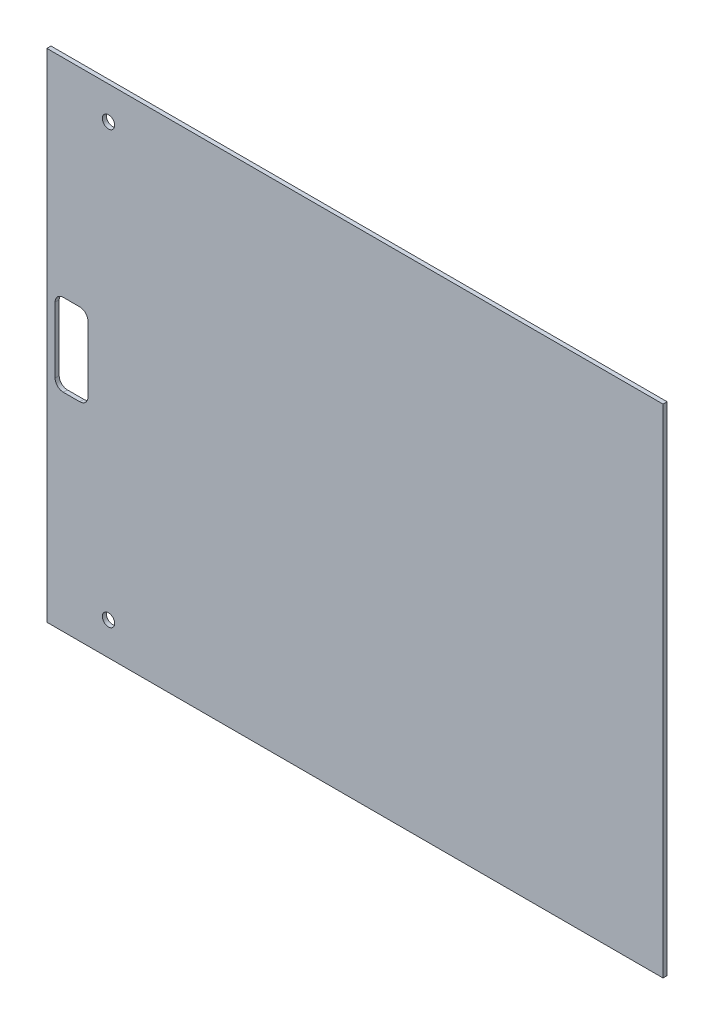
ISO-10303-21;
HEADER;
FILE_DESCRIPTION(('STEP AP214'),'2;1');
FILE_NAME('part.step','',(''),(''),'','','');
FILE_SCHEMA(('AUTOMOTIVE_DESIGN { 1 0 10303 214 1 1 1 1 }'));
ENDSEC;
DATA;
#1=APPLICATION_CONTEXT('core data for automotive mechanical design processes');
#2=APPLICATION_PROTOCOL_DEFINITION('international standard','automotive_design',2000,#1);
#3=PRODUCT_CONTEXT('',#1,'mechanical');
#4=PRODUCT('Part','Part','',(#3));
#5=PRODUCT_RELATED_PRODUCT_CATEGORY('part','',(#4));
#6=PRODUCT_DEFINITION_FORMATION('','',#4);
#7=PRODUCT_DEFINITION_CONTEXT('part definition',#1,'design');
#8=PRODUCT_DEFINITION('design','',#6,#7);
#9=PRODUCT_DEFINITION_SHAPE('','',#8);
#10=(LENGTH_UNIT() NAMED_UNIT(*) SI_UNIT(.MILLI.,.METRE.));
#11=(NAMED_UNIT(*) PLANE_ANGLE_UNIT() SI_UNIT($,.RADIAN.));
#12=(NAMED_UNIT(*) SI_UNIT($,.STERADIAN.) SOLID_ANGLE_UNIT());
#13=UNCERTAINTY_MEASURE_WITH_UNIT(LENGTH_MEASURE(1.E-05),#10,'distance_accuracy_value','');
#14=(GEOMETRIC_REPRESENTATION_CONTEXT(3) GLOBAL_UNCERTAINTY_ASSIGNED_CONTEXT((#13)) GLOBAL_UNIT_ASSIGNED_CONTEXT((#10,
#11,#12)) REPRESENTATION_CONTEXT('',''));
#15=CARTESIAN_POINT('',(0.,0.,0.));
#16=DIRECTION('',(0.,0.,1.));
#17=DIRECTION('',(1.,0.,0.));
#18=AXIS2_PLACEMENT_3D('',#15,#16,#17);
#19=CARTESIAN_POINT('',(0.,0.,1.));
#20=DIRECTION('',(0.,0.,1.));
#21=DIRECTION('',(1.,0.,0.));
#22=AXIS2_PLACEMENT_3D('',#19,#20,#21);
#23=PLANE('',#22);
#24=CARTESIAN_POINT('',(-60.,52.5,1.));
#25=DIRECTION('',(0.,0.,1.));
#26=DIRECTION('',(1.,0.,0.));
#27=AXIS2_PLACEMENT_3D('',#24,#25,#26);
#28=CIRCLE('',#27,1.5);
#29=CARTESIAN_POINT('',(-58.5,52.5,1.));
#30=VERTEX_POINT('',#29);
#31=EDGE_CURVE('E193',#30,#30,#28,.T.);
#32=ORIENTED_EDGE('',*,*,#31,.F.);
#33=EDGE_LOOP('',(#32));
#34=FACE_BOUND('',#33,.T.);
#35=DIRECTION('',(0.,1.,0.));
#36=VECTOR('',#35,1.);
#37=CARTESIAN_POINT('',(75.,60.5,1.));
#38=LINE('',#37,#36);
#39=CARTESIAN_POINT('',(75.,-60.5,1.));
#40=VERTEX_POINT('',#39);
#41=CARTESIAN_POINT('',(75.,60.5,1.));
#42=VERTEX_POINT('',#41);
#43=EDGE_CURVE('E199',#40,#42,#38,.T.);
#44=ORIENTED_EDGE('',*,*,#43,.T.);
#45=DIRECTION('',(-1.,0.,0.));
#46=VECTOR('',#45,1.);
#47=CARTESIAN_POINT('',(-75.,60.5,1.));
#48=LINE('',#47,#46);
#49=CARTESIAN_POINT('',(-75.,60.5,1.));
#50=VERTEX_POINT('',#49);
#51=EDGE_CURVE('E202',#42,#50,#48,.T.);
#52=ORIENTED_EDGE('',*,*,#51,.T.);
#53=DIRECTION('',(0.,-1.,0.));
#54=VECTOR('',#53,1.);
#55=CARTESIAN_POINT('',(-75.,60.5,1.));
#56=LINE('',#55,#54);
#57=CARTESIAN_POINT('',(-75.,-60.5,1.));
#58=VERTEX_POINT('',#57);
#59=EDGE_CURVE('E205',#50,#58,#56,.T.);
#60=ORIENTED_EDGE('',*,*,#59,.T.);
#61=DIRECTION('',(1.,0.,0.));
#62=VECTOR('',#61,1.);
#63=CARTESIAN_POINT('',(-75.,-60.5,1.));
#64=LINE('',#63,#62);
#65=EDGE_CURVE('E207',#58,#40,#64,.T.);
#66=ORIENTED_EDGE('',*,*,#65,.T.);
#67=EDGE_LOOP('',(#44,#52,#60,#66));
#68=FACE_BOUND('',#67,.T.);
#69=CARTESIAN_POINT('',(-60.,-52.5,1.));
#70=DIRECTION('',(0.,0.,1.));
#71=DIRECTION('',(1.,0.,0.));
#72=AXIS2_PLACEMENT_3D('',#69,#70,#71);
#73=CIRCLE('',#72,1.5);
#74=CARTESIAN_POINT('',(-58.5,-52.5,1.));
#75=VERTEX_POINT('',#74);
#76=EDGE_CURVE('E187',#75,#75,#73,.T.);
#77=ORIENTED_EDGE('',*,*,#76,.F.);
#78=EDGE_LOOP('',(#77));
#79=FACE_BOUND('',#78,.T.);
#80=DIRECTION('',(0.,1.,0.));
#81=VECTOR('',#80,1.);
#82=CARTESIAN_POINT('',(-65.,7.99999999999999,1.));
#83=LINE('',#82,#81);
#84=CARTESIAN_POINT('',(-65.,-8.,1.));
#85=VERTEX_POINT('',#84);
#86=CARTESIAN_POINT('',(-65.,7.99999999999999,1.));
#87=VERTEX_POINT('',#86);
#88=EDGE_CURVE('E130',#85,#87,#83,.T.);
#89=ORIENTED_EDGE('',*,*,#88,.F.);
#90=CARTESIAN_POINT('',(-67.,-8.00000000000001,1.));
#91=DIRECTION('',(0.,0.,1.));
#92=DIRECTION('',(1.,0.,0.));
#93=AXIS2_PLACEMENT_3D('',#90,#91,#92);
#94=CIRCLE('',#93,2.);
#95=CARTESIAN_POINT('',(-67.,-10.,1.));
#96=VERTEX_POINT('',#95);
#97=EDGE_CURVE('E122',#96,#85,#94,.T.);
#98=ORIENTED_EDGE('',*,*,#97,.F.);
#99=DIRECTION('',(1.,0.,0.));
#100=VECTOR('',#99,1.);
#101=CARTESIAN_POINT('',(-71.,-10.,1.));
#102=LINE('',#101,#100);
#103=CARTESIAN_POINT('',(-71.,-10.,1.));
#104=VERTEX_POINT('',#103);
#105=EDGE_CURVE('E155',#104,#96,#102,.T.);
#106=ORIENTED_EDGE('',*,*,#105,.F.);
#107=CARTESIAN_POINT('',(-71.,-8.00000000000001,1.));
#108=DIRECTION('',(0.,0.,1.));
#109=DIRECTION('',(1.,0.,0.));
#110=AXIS2_PLACEMENT_3D('',#107,#108,#109);
#111=CIRCLE('',#110,2.);
#112=CARTESIAN_POINT('',(-73.,-8.00000000000001,1.));
#113=VERTEX_POINT('',#112);
#114=EDGE_CURVE('E153',#113,#104,#111,.T.);
#115=ORIENTED_EDGE('',*,*,#114,.F.);
#116=DIRECTION('',(0.,-1.,0.));
#117=VECTOR('',#116,1.);
#118=CARTESIAN_POINT('',(-73.,8.,1.));
#119=LINE('',#118,#117);
#120=CARTESIAN_POINT('',(-73.,8.,1.));
#121=VERTEX_POINT('',#120);
#122=EDGE_CURVE('E151',#121,#113,#119,.T.);
#123=ORIENTED_EDGE('',*,*,#122,.F.);
#124=CARTESIAN_POINT('',(-71.,7.99999999999999,1.));
#125=DIRECTION('',(0.,0.,1.));
#126=DIRECTION('',(1.,0.,0.));
#127=AXIS2_PLACEMENT_3D('',#124,#125,#126);
#128=CIRCLE('',#127,2.);
#129=CARTESIAN_POINT('',(-71.,9.99999999999999,1.));
#130=VERTEX_POINT('',#129);
#131=EDGE_CURVE('E149',#130,#121,#128,.T.);
#132=ORIENTED_EDGE('',*,*,#131,.F.);
#133=DIRECTION('',(-1.,0.,0.));
#134=VECTOR('',#133,1.);
#135=CARTESIAN_POINT('',(-71.,9.99999999999999,1.));
#136=LINE('',#135,#134);
#137=CARTESIAN_POINT('',(-67.,9.99999999999999,1.));
#138=VERTEX_POINT('',#137);
#139=EDGE_CURVE('E145',#138,#130,#136,.T.);
#140=ORIENTED_EDGE('',*,*,#139,.F.);
#141=CARTESIAN_POINT('',(-67.,7.99999999999999,1.));
#142=DIRECTION('',(0.,0.,1.));
#143=DIRECTION('',(-1.,0.,0.));
#144=AXIS2_PLACEMENT_3D('',#141,#142,#143);
#145=CIRCLE('',#144,2.);
#146=EDGE_CURVE('E143',#87,#138,#145,.T.);
#147=ORIENTED_EDGE('',*,*,#146,.F.);
#148=EDGE_LOOP('',(#89,#98,#106,#115,#123,#132,#140,#147));
#149=FACE_BOUND('',#148,.T.);
#150=ADVANCED_FACE('F33',(#34,#68,#79,#149),#23,.T.);
#151=CARTESIAN_POINT('',(0.,0.,0.));
#152=DIRECTION('',(0.,0.,1.));
#153=DIRECTION('',(1.,0.,0.));
#154=AXIS2_PLACEMENT_3D('',#151,#152,#153);
#155=PLANE('',#154);
#156=CARTESIAN_POINT('',(-60.,-52.5,0.));
#157=DIRECTION('',(0.,0.,1.));
#158=DIRECTION('',(1.,0.,0.));
#159=AXIS2_PLACEMENT_3D('',#156,#157,#158);
#160=CIRCLE('',#159,1.5);
#161=CARTESIAN_POINT('',(-58.5,-52.5,0.));
#162=VERTEX_POINT('',#161);
#163=EDGE_CURVE('E138',#162,#162,#160,.T.);
#164=ORIENTED_EDGE('',*,*,#163,.T.);
#165=EDGE_LOOP('',(#164));
#166=FACE_BOUND('',#165,.T.);
#167=CARTESIAN_POINT('',(-60.,52.5,0.));
#168=DIRECTION('',(0.,0.,1.));
#169=DIRECTION('',(1.,0.,0.));
#170=AXIS2_PLACEMENT_3D('',#167,#168,#169);
#171=CIRCLE('',#170,1.5);
#172=CARTESIAN_POINT('',(-58.5,52.5,0.));
#173=VERTEX_POINT('',#172);
#174=EDGE_CURVE('E190',#173,#173,#171,.T.);
#175=ORIENTED_EDGE('',*,*,#174,.T.);
#176=EDGE_LOOP('',(#175));
#177=FACE_BOUND('',#176,.T.);
#178=DIRECTION('',(0.,1.,0.));
#179=VECTOR('',#178,1.);
#180=CARTESIAN_POINT('',(75.,60.5,0.));
#181=LINE('',#180,#179);
#182=CARTESIAN_POINT('',(75.,-60.5,0.));
#183=VERTEX_POINT('',#182);
#184=CARTESIAN_POINT('',(75.,60.5,0.));
#185=VERTEX_POINT('',#184);
#186=EDGE_CURVE('E196',#183,#185,#181,.T.);
#187=ORIENTED_EDGE('',*,*,#186,.F.);
#188=DIRECTION('',(1.,0.,0.));
#189=VECTOR('',#188,1.);
#190=CARTESIAN_POINT('',(-75.,-60.5,0.));
#191=LINE('',#190,#189);
#192=CARTESIAN_POINT('',(-75.,-60.5,0.));
#193=VERTEX_POINT('',#192);
#194=EDGE_CURVE('E203',#193,#183,#191,.T.);
#195=ORIENTED_EDGE('',*,*,#194,.F.);
#196=DIRECTION('',(0.,-1.,0.));
#197=VECTOR('',#196,1.);
#198=CARTESIAN_POINT('',(-75.,60.5,0.));
#199=LINE('',#198,#197);
#200=CARTESIAN_POINT('',(-75.,60.5,0.));
#201=VERTEX_POINT('',#200);
#202=EDGE_CURVE('E214',#201,#193,#199,.T.);
#203=ORIENTED_EDGE('',*,*,#202,.F.);
#204=DIRECTION('',(-1.,0.,0.));
#205=VECTOR('',#204,1.);
#206=CARTESIAN_POINT('',(-75.,60.5,0.));
#207=LINE('',#206,#205);
#208=EDGE_CURVE('E212',#185,#201,#207,.T.);
#209=ORIENTED_EDGE('',*,*,#208,.F.);
#210=EDGE_LOOP('',(#187,#195,#203,#209));
#211=FACE_BOUND('',#210,.T.);
#212=CARTESIAN_POINT('',(-67.,-8.00000000000001,0.));
#213=DIRECTION('',(0.,0.,1.));
#214=DIRECTION('',(1.,0.,0.));
#215=AXIS2_PLACEMENT_3D('',#212,#213,#214);
#216=CIRCLE('',#215,2.);
#217=CARTESIAN_POINT('',(-67.,-10.,0.));
#218=VERTEX_POINT('',#217);
#219=CARTESIAN_POINT('',(-65.,-8.,0.));
#220=VERTEX_POINT('',#219);
#221=EDGE_CURVE('E56',#218,#220,#216,.T.);
#222=ORIENTED_EDGE('',*,*,#221,.T.);
#223=DIRECTION('',(0.,1.,0.));
#224=VECTOR('',#223,1.);
#225=CARTESIAN_POINT('',(-65.,7.99999999999999,0.));
#226=LINE('',#225,#224);
#227=CARTESIAN_POINT('',(-65.,7.99999999999999,0.));
#228=VERTEX_POINT('',#227);
#229=EDGE_CURVE('E137',#220,#228,#226,.T.);
#230=ORIENTED_EDGE('',*,*,#229,.T.);
#231=CARTESIAN_POINT('',(-67.,7.99999999999999,0.));
#232=DIRECTION('',(0.,0.,1.));
#233=DIRECTION('',(-1.,0.,0.));
#234=AXIS2_PLACEMENT_3D('',#231,#232,#233);
#235=CIRCLE('',#234,2.);
#236=CARTESIAN_POINT('',(-67.,9.99999999999999,0.));
#237=VERTEX_POINT('',#236);
#238=EDGE_CURVE('E159',#228,#237,#235,.T.);
#239=ORIENTED_EDGE('',*,*,#238,.T.);
#240=DIRECTION('',(-1.,0.,0.));
#241=VECTOR('',#240,1.);
#242=CARTESIAN_POINT('',(-71.,9.99999999999999,0.));
#243=LINE('',#242,#241);
#244=CARTESIAN_POINT('',(-71.,9.99999999999999,0.));
#245=VERTEX_POINT('',#244);
#246=EDGE_CURVE('E162',#237,#245,#243,.T.);
#247=ORIENTED_EDGE('',*,*,#246,.T.);
#248=CARTESIAN_POINT('',(-71.,7.99999999999999,0.));
#249=DIRECTION('',(0.,0.,1.));
#250=DIRECTION('',(1.,0.,0.));
#251=AXIS2_PLACEMENT_3D('',#248,#249,#250);
#252=CIRCLE('',#251,2.);
#253=CARTESIAN_POINT('',(-73.,8.,0.));
#254=VERTEX_POINT('',#253);
#255=EDGE_CURVE('E165',#245,#254,#252,.T.);
#256=ORIENTED_EDGE('',*,*,#255,.T.);
#257=DIRECTION('',(0.,-1.,0.));
#258=VECTOR('',#257,1.);
#259=CARTESIAN_POINT('',(-73.,8.,0.));
#260=LINE('',#259,#258);
#261=CARTESIAN_POINT('',(-73.,-8.00000000000001,0.));
#262=VERTEX_POINT('',#261);
#263=EDGE_CURVE('E168',#254,#262,#260,.T.);
#264=ORIENTED_EDGE('',*,*,#263,.T.);
#265=CARTESIAN_POINT('',(-71.,-8.00000000000001,0.));
#266=DIRECTION('',(0.,0.,1.));
#267=DIRECTION('',(1.,0.,0.));
#268=AXIS2_PLACEMENT_3D('',#265,#266,#267);
#269=CIRCLE('',#268,2.);
#270=CARTESIAN_POINT('',(-71.,-10.,0.));
#271=VERTEX_POINT('',#270);
#272=EDGE_CURVE('E171',#262,#271,#269,.T.);
#273=ORIENTED_EDGE('',*,*,#272,.T.);
#274=DIRECTION('',(1.,0.,0.));
#275=VECTOR('',#274,1.);
#276=CARTESIAN_POINT('',(-71.,-10.,0.));
#277=LINE('',#276,#275);
#278=EDGE_CURVE('E131',#271,#218,#277,.T.);
#279=ORIENTED_EDGE('',*,*,#278,.T.);
#280=EDGE_LOOP('',(#222,#230,#239,#247,#256,#264,#273,#279));
#281=FACE_BOUND('',#280,.T.);
#282=ADVANCED_FACE('F232',(#166,#177,#211,#281),#155,.F.);
#283=CARTESIAN_POINT('',(75.,60.5,1.));
#284=DIRECTION('',(-1.,0.,0.));
#285=DIRECTION('',(0.,0.,1.));
#286=AXIS2_PLACEMENT_3D('',#283,#284,#285);
#287=PLANE('',#286);
#288=ORIENTED_EDGE('',*,*,#186,.T.);
#289=DIRECTION('',(0.,0.,-1.));
#290=VECTOR('',#289,1.);
#291=CARTESIAN_POINT('',(75.,60.5,1.));
#292=LINE('',#291,#290);
#293=EDGE_CURVE('E11',#42,#185,#292,.T.);
#294=ORIENTED_EDGE('',*,*,#293,.F.);
#295=ORIENTED_EDGE('',*,*,#43,.F.);
#296=DIRECTION('',(0.,0.,-1.));
#297=VECTOR('',#296,1.);
#298=CARTESIAN_POINT('',(75.,-60.5,1.));
#299=LINE('',#298,#297);
#300=EDGE_CURVE('E209',#40,#183,#299,.T.);
#301=ORIENTED_EDGE('',*,*,#300,.T.);
#302=EDGE_LOOP('',(#288,#294,#295,#301));
#303=FACE_BOUND('',#302,.T.);
#304=ADVANCED_FACE('F35',(#303),#287,.F.);
#305=CARTESIAN_POINT('',(-75.,60.5,1.));
#306=DIRECTION('',(0.,-1.,0.));
#307=DIRECTION('',(0.,0.,-1.));
#308=AXIS2_PLACEMENT_3D('',#305,#306,#307);
#309=PLANE('',#308);
#310=ORIENTED_EDGE('',*,*,#208,.T.);
#311=DIRECTION('',(0.,0.,-1.));
#312=VECTOR('',#311,1.);
#313=CARTESIAN_POINT('',(-75.,60.5,1.));
#314=LINE('',#313,#312);
#315=EDGE_CURVE('E41',#50,#201,#314,.T.);
#316=ORIENTED_EDGE('',*,*,#315,.F.);
#317=ORIENTED_EDGE('',*,*,#51,.F.);
#318=ORIENTED_EDGE('',*,*,#293,.T.);
#319=EDGE_LOOP('',(#310,#316,#317,#318));
#320=FACE_BOUND('',#319,.T.);
#321=ADVANCED_FACE('F243',(#320),#309,.F.);
#322=CARTESIAN_POINT('',(-75.,60.5,1.));
#323=DIRECTION('',(1.,0.,0.));
#324=DIRECTION('',(0.,0.,-1.));
#325=AXIS2_PLACEMENT_3D('',#322,#323,#324);
#326=PLANE('',#325);
#327=ORIENTED_EDGE('',*,*,#202,.T.);
#328=DIRECTION('',(0.,0.,-1.));
#329=VECTOR('',#328,1.);
#330=CARTESIAN_POINT('',(-75.,-60.5,1.));
#331=LINE('',#330,#329);
#332=EDGE_CURVE('E219',#58,#193,#331,.T.);
#333=ORIENTED_EDGE('',*,*,#332,.F.);
#334=ORIENTED_EDGE('',*,*,#59,.F.);
#335=ORIENTED_EDGE('',*,*,#315,.T.);
#336=EDGE_LOOP('',(#327,#333,#334,#335));
#337=FACE_BOUND('',#336,.T.);
#338=ADVANCED_FACE('F226',(#337),#326,.F.);
#339=CARTESIAN_POINT('',(-75.,-60.5,1.));
#340=DIRECTION('',(0.,1.,0.));
#341=DIRECTION('',(0.,0.,1.));
#342=AXIS2_PLACEMENT_3D('',#339,#340,#341);
#343=PLANE('',#342);
#344=ORIENTED_EDGE('',*,*,#194,.T.);
#345=ORIENTED_EDGE('',*,*,#300,.F.);
#346=ORIENTED_EDGE('',*,*,#65,.F.);
#347=ORIENTED_EDGE('',*,*,#332,.T.);
#348=EDGE_LOOP('',(#344,#345,#346,#347));
#349=FACE_BOUND('',#348,.T.);
#350=ADVANCED_FACE('F236',(#349),#343,.F.);
#351=CARTESIAN_POINT('',(-60.,52.5,1.));
#352=DIRECTION('',(0.,0.,-1.));
#353=DIRECTION('',(-1.,0.,0.));
#354=AXIS2_PLACEMENT_3D('',#351,#352,#353);
#355=CYLINDRICAL_SURFACE('',#354,1.5);
#356=ORIENTED_EDGE('',*,*,#31,.T.);
#357=EDGE_LOOP('',(#356));
#358=FACE_BOUND('',#357,.T.);
#359=ORIENTED_EDGE('',*,*,#174,.F.);
#360=EDGE_LOOP('',(#359));
#361=FACE_BOUND('',#360,.T.);
#362=ADVANCED_FACE('F260',(#358,#361),#355,.F.);
#363=CARTESIAN_POINT('',(-60.,-52.5,1.));
#364=DIRECTION('',(0.,0.,-1.));
#365=DIRECTION('',(-1.,0.,0.));
#366=AXIS2_PLACEMENT_3D('',#363,#364,#365);
#367=CYLINDRICAL_SURFACE('',#366,1.5);
#368=ORIENTED_EDGE('',*,*,#76,.T.);
#369=EDGE_LOOP('',(#368));
#370=FACE_BOUND('',#369,.T.);
#371=ORIENTED_EDGE('',*,*,#163,.F.);
#372=EDGE_LOOP('',(#371));
#373=FACE_BOUND('',#372,.T.);
#374=ADVANCED_FACE('F267',(#370,#373),#367,.F.);
#375=CARTESIAN_POINT('',(-67.,-8.00000000000001,1.));
#376=DIRECTION('',(0.,0.,-1.));
#377=DIRECTION('',(-1.,0.,0.));
#378=AXIS2_PLACEMENT_3D('',#375,#376,#377);
#379=CYLINDRICAL_SURFACE('',#378,2.);
#380=ORIENTED_EDGE('',*,*,#221,.F.);
#381=DIRECTION('',(0.,0.,-1.));
#382=VECTOR('',#381,1.);
#383=CARTESIAN_POINT('',(-67.,-10.,1.));
#384=LINE('',#383,#382);
#385=EDGE_CURVE('E126',#96,#218,#384,.T.);
#386=ORIENTED_EDGE('',*,*,#385,.F.);
#387=ORIENTED_EDGE('',*,*,#97,.T.);
#388=DIRECTION('',(0.,0.,-1.));
#389=VECTOR('',#388,1.);
#390=CARTESIAN_POINT('',(-65.,-8.,1.));
#391=LINE('',#390,#389);
#392=EDGE_CURVE('E125',#85,#220,#391,.T.);
#393=ORIENTED_EDGE('',*,*,#392,.T.);
#394=EDGE_LOOP('',(#380,#386,#387,#393));
#395=FACE_BOUND('',#394,.T.);
#396=ADVANCED_FACE('F124',(#395),#379,.F.);
#397=CARTESIAN_POINT('',(-65.,7.99999999999999,1.));
#398=DIRECTION('',(-1.,0.,0.));
#399=DIRECTION('',(0.,0.,1.));
#400=AXIS2_PLACEMENT_3D('',#397,#398,#399);
#401=PLANE('',#400);
#402=ORIENTED_EDGE('',*,*,#229,.F.);
#403=ORIENTED_EDGE('',*,*,#392,.F.);
#404=ORIENTED_EDGE('',*,*,#88,.T.);
#405=DIRECTION('',(0.,0.,-1.));
#406=VECTOR('',#405,1.);
#407=CARTESIAN_POINT('',(-65.,7.99999999999999,1.));
#408=LINE('',#407,#406);
#409=EDGE_CURVE('E139',#87,#228,#408,.T.);
#410=ORIENTED_EDGE('',*,*,#409,.T.);
#411=EDGE_LOOP('',(#402,#403,#404,#410));
#412=FACE_BOUND('',#411,.T.);
#413=ADVANCED_FACE('F134',(#412),#401,.T.);
#414=CARTESIAN_POINT('',(-67.,7.99999999999999,1.));
#415=DIRECTION('',(0.,0.,-1.));
#416=DIRECTION('',(-1.,0.,0.));
#417=AXIS2_PLACEMENT_3D('',#414,#415,#416);
#418=CYLINDRICAL_SURFACE('',#417,2.);
#419=ORIENTED_EDGE('',*,*,#238,.F.);
#420=ORIENTED_EDGE('',*,*,#409,.F.);
#421=ORIENTED_EDGE('',*,*,#146,.T.);
#422=DIRECTION('',(0.,0.,-1.));
#423=VECTOR('',#422,1.);
#424=CARTESIAN_POINT('',(-67.,9.99999999999999,1.));
#425=LINE('',#424,#423);
#426=EDGE_CURVE('E184',#138,#237,#425,.T.);
#427=ORIENTED_EDGE('',*,*,#426,.T.);
#428=EDGE_LOOP('',(#419,#420,#421,#427));
#429=FACE_BOUND('',#428,.T.);
#430=ADVANCED_FACE('F284',(#429),#418,.F.);
#431=CARTESIAN_POINT('',(-71.,9.99999999999999,1.));
#432=DIRECTION('',(0.,-1.,0.));
#433=DIRECTION('',(0.,0.,-1.));
#434=AXIS2_PLACEMENT_3D('',#431,#432,#433);
#435=PLANE('',#434);
#436=ORIENTED_EDGE('',*,*,#246,.F.);
#437=ORIENTED_EDGE('',*,*,#426,.F.);
#438=ORIENTED_EDGE('',*,*,#139,.T.);
#439=DIRECTION('',(0.,0.,-1.));
#440=VECTOR('',#439,1.);
#441=CARTESIAN_POINT('',(-71.,9.99999999999999,1.));
#442=LINE('',#441,#440);
#443=EDGE_CURVE('E182',#130,#245,#442,.T.);
#444=ORIENTED_EDGE('',*,*,#443,.T.);
#445=EDGE_LOOP('',(#436,#437,#438,#444));
#446=FACE_BOUND('',#445,.T.);
#447=ADVANCED_FACE('F287',(#446),#435,.T.);
#448=CARTESIAN_POINT('',(-71.,7.99999999999999,1.));
#449=DIRECTION('',(0.,0.,-1.));
#450=DIRECTION('',(-1.,0.,0.));
#451=AXIS2_PLACEMENT_3D('',#448,#449,#450);
#452=CYLINDRICAL_SURFACE('',#451,2.);
#453=ORIENTED_EDGE('',*,*,#255,.F.);
#454=ORIENTED_EDGE('',*,*,#443,.F.);
#455=ORIENTED_EDGE('',*,*,#131,.T.);
#456=DIRECTION('',(0.,0.,-1.));
#457=VECTOR('',#456,1.);
#458=CARTESIAN_POINT('',(-73.,8.,1.));
#459=LINE('',#458,#457);
#460=EDGE_CURVE('E180',#121,#254,#459,.T.);
#461=ORIENTED_EDGE('',*,*,#460,.T.);
#462=EDGE_LOOP('',(#453,#454,#455,#461));
#463=FACE_BOUND('',#462,.T.);
#464=ADVANCED_FACE('F291',(#463),#452,.F.);
#465=CARTESIAN_POINT('',(-73.,8.,1.));
#466=DIRECTION('',(1.,0.,0.));
#467=DIRECTION('',(0.,0.,-1.));
#468=AXIS2_PLACEMENT_3D('',#465,#466,#467);
#469=PLANE('',#468);
#470=ORIENTED_EDGE('',*,*,#263,.F.);
#471=ORIENTED_EDGE('',*,*,#460,.F.);
#472=ORIENTED_EDGE('',*,*,#122,.T.);
#473=DIRECTION('',(0.,0.,-1.));
#474=VECTOR('',#473,1.);
#475=CARTESIAN_POINT('',(-73.,-8.00000000000001,1.));
#476=LINE('',#475,#474);
#477=EDGE_CURVE('E178',#113,#262,#476,.T.);
#478=ORIENTED_EDGE('',*,*,#477,.T.);
#479=EDGE_LOOP('',(#470,#471,#472,#478));
#480=FACE_BOUND('',#479,.T.);
#481=ADVANCED_FACE('F295',(#480),#469,.T.);
#482=CARTESIAN_POINT('',(-71.,-8.00000000000001,1.));
#483=DIRECTION('',(0.,0.,-1.));
#484=DIRECTION('',(-1.,0.,0.));
#485=AXIS2_PLACEMENT_3D('',#482,#483,#484);
#486=CYLINDRICAL_SURFACE('',#485,2.);
#487=ORIENTED_EDGE('',*,*,#272,.F.);
#488=ORIENTED_EDGE('',*,*,#477,.F.);
#489=ORIENTED_EDGE('',*,*,#114,.T.);
#490=DIRECTION('',(0.,0.,-1.));
#491=VECTOR('',#490,1.);
#492=CARTESIAN_POINT('',(-71.,-10.,1.));
#493=LINE('',#492,#491);
#494=EDGE_CURVE('E48',#104,#271,#493,.T.);
#495=ORIENTED_EDGE('',*,*,#494,.T.);
#496=EDGE_LOOP('',(#487,#488,#489,#495));
#497=FACE_BOUND('',#496,.T.);
#498=ADVANCED_FACE('F299',(#497),#486,.F.);
#499=CARTESIAN_POINT('',(-71.,-10.,1.));
#500=DIRECTION('',(0.,1.,0.));
#501=DIRECTION('',(0.,0.,1.));
#502=AXIS2_PLACEMENT_3D('',#499,#500,#501);
#503=PLANE('',#502);
#504=ORIENTED_EDGE('',*,*,#278,.F.);
#505=ORIENTED_EDGE('',*,*,#494,.F.);
#506=ORIENTED_EDGE('',*,*,#105,.T.);
#507=ORIENTED_EDGE('',*,*,#385,.T.);
#508=EDGE_LOOP('',(#504,#505,#506,#507));
#509=FACE_BOUND('',#508,.T.);
#510=ADVANCED_FACE('F303',(#509),#503,.T.);
#511=CLOSED_SHELL('',(#150,#282,#304,#321,#338,#350,#362,#374,#396,#413,#430,#447,#464,#481,
#498,#510));
#512=MANIFOLD_SOLID_BREP('B2',#511);
#513=ADVANCED_BREP_SHAPE_REPRESENTATION('',(#18,#512),#14);
#514=SHAPE_DEFINITION_REPRESENTATION(#9,#513);
ENDSEC;
END-ISO-10303-21;
